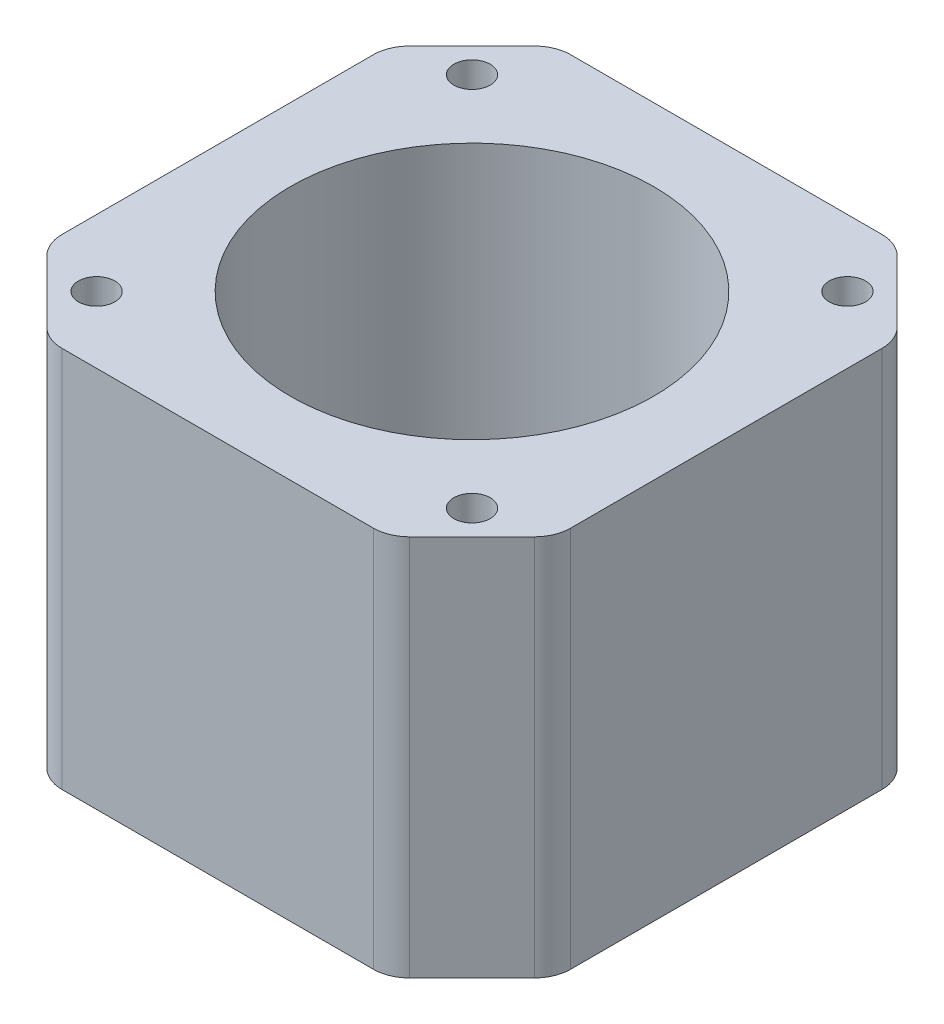
ISO-10303-21;
HEADER;
FILE_DESCRIPTION(('STEP AP214'),'2;1');
FILE_NAME('part.step','',(''),(''),'','','');
FILE_SCHEMA(('AUTOMOTIVE_DESIGN { 1 0 10303 214 1 1 1 1 }'));
ENDSEC;
DATA;
#1=APPLICATION_CONTEXT('core data for automotive mechanical design processes');
#2=APPLICATION_PROTOCOL_DEFINITION('international standard','automotive_design',2000,#1);
#3=PRODUCT_CONTEXT('',#1,'mechanical');
#4=PRODUCT('Part','Part','',(#3));
#5=PRODUCT_RELATED_PRODUCT_CATEGORY('part','',(#4));
#6=PRODUCT_DEFINITION_FORMATION('','',#4);
#7=PRODUCT_DEFINITION_CONTEXT('part definition',#1,'design');
#8=PRODUCT_DEFINITION('design','',#6,#7);
#9=PRODUCT_DEFINITION_SHAPE('','',#8);
#10=(LENGTH_UNIT() NAMED_UNIT(*) SI_UNIT(.MILLI.,.METRE.));
#11=(NAMED_UNIT(*) PLANE_ANGLE_UNIT() SI_UNIT($,.RADIAN.));
#12=(NAMED_UNIT(*) SI_UNIT($,.STERADIAN.) SOLID_ANGLE_UNIT());
#13=UNCERTAINTY_MEASURE_WITH_UNIT(LENGTH_MEASURE(1.E-05),#10,'distance_accuracy_value','');
#14=(GEOMETRIC_REPRESENTATION_CONTEXT(3) GLOBAL_UNCERTAINTY_ASSIGNED_CONTEXT((#13)) GLOBAL_UNIT_ASSIGNED_CONTEXT((#10,
#11,#12)) REPRESENTATION_CONTEXT('',''));
#15=CARTESIAN_POINT('',(0.,0.,0.));
#16=DIRECTION('',(0.,0.,1.));
#17=DIRECTION('',(1.,0.,0.));
#18=AXIS2_PLACEMENT_3D('',#15,#16,#17);
#19=CARTESIAN_POINT('',(-12.85735931288,0.,18.));
#20=DIRECTION('',(0.,1.,0.));
#21=DIRECTION('',(0.,0.,1.));
#22=AXIS2_PLACEMENT_3D('',#19,#20,#21);
#23=CYLINDRICAL_SURFACE('',#22,3.00000000000053);
#24=CARTESIAN_POINT('',(-12.85735931288,31.55,18.));
#25=DIRECTION('',(0.,1.,0.));
#26=DIRECTION('',(0.,0.,1.));
#27=AXIS2_PLACEMENT_3D('',#24,#25,#26);
#28=CIRCLE('',#27,3.00000000000053);
#29=CARTESIAN_POINT('',(-14.97867965644,31.55,20.12132034356));
#30=VERTEX_POINT('',#29);
#31=CARTESIAN_POINT('',(-12.8573593128803,31.55,21.0000000000006));
#32=VERTEX_POINT('',#31);
#33=EDGE_CURVE('E178',#30,#32,#28,.T.);
#34=ORIENTED_EDGE('',*,*,#33,.F.);
#35=DIRECTION('',(0.,1.,0.));
#36=VECTOR('',#35,1.);
#37=CARTESIAN_POINT('',(-14.97867965644,0.,20.12132034356));
#38=LINE('',#37,#36);
#39=CARTESIAN_POINT('',(-14.97867965644,0.,20.12132034356));
#40=VERTEX_POINT('',#39);
#41=EDGE_CURVE('E11',#40,#30,#38,.T.);
#42=ORIENTED_EDGE('',*,*,#41,.F.);
#43=CARTESIAN_POINT('',(-12.85735931288,0.,18.));
#44=DIRECTION('',(0.,1.,0.));
#45=DIRECTION('',(0.,0.,1.));
#46=AXIS2_PLACEMENT_3D('',#43,#44,#45);
#47=CIRCLE('',#46,3.00000000000053);
#48=CARTESIAN_POINT('',(-12.8573593128803,0.,21.0000000000006));
#49=VERTEX_POINT('',#48);
#50=EDGE_CURVE('E223',#40,#49,#47,.T.);
#51=ORIENTED_EDGE('',*,*,#50,.T.);
#52=DIRECTION('',(0.,1.,0.));
#53=VECTOR('',#52,1.);
#54=CARTESIAN_POINT('',(-12.8573593128803,0.,21.0000000000006));
#55=LINE('',#54,#53);
#56=EDGE_CURVE('E36',#49,#32,#55,.T.);
#57=ORIENTED_EDGE('',*,*,#56,.T.);
#58=EDGE_LOOP('',(#34,#42,#51,#57));
#59=FACE_BOUND('',#58,.T.);
#60=ADVANCED_FACE('F33',(#59),#23,.T.);
#61=CARTESIAN_POINT('',(-20.1213203435597,0.,14.9786796564406));
#62=DIRECTION('',(-0.707106781186531,0.,0.707106781186564));
#63=DIRECTION('',(0.707106781186564,0.,0.707106781186531));
#64=AXIS2_PLACEMENT_3D('',#61,#62,#63);
#65=PLANE('',#64);
#66=DIRECTION('',(0.707106781186564,0.,0.707106781186531));
#67=VECTOR('',#66,1.);
#68=CARTESIAN_POINT('',(-20.1213203435597,31.55,14.9786796564406));
#69=LINE('',#68,#67);
#70=CARTESIAN_POINT('',(-20.1213203435597,31.55,14.9786796564406));
#71=VERTEX_POINT('',#70);
#72=EDGE_CURVE('E221',#71,#30,#69,.T.);
#73=ORIENTED_EDGE('',*,*,#72,.F.);
#74=DIRECTION('',(0.,1.,0.));
#75=VECTOR('',#74,1.);
#76=CARTESIAN_POINT('',(-20.1213203435597,0.,14.9786796564406));
#77=LINE('',#76,#75);
#78=CARTESIAN_POINT('',(-20.1213203435597,0.,14.9786796564406));
#79=VERTEX_POINT('',#78);
#80=EDGE_CURVE('E42',#79,#71,#77,.T.);
#81=ORIENTED_EDGE('',*,*,#80,.F.);
#82=DIRECTION('',(0.707106781186564,0.,0.707106781186531));
#83=VECTOR('',#82,1.);
#84=CARTESIAN_POINT('',(-20.1213203435597,0.,14.9786796564406));
#85=LINE('',#84,#83);
#86=EDGE_CURVE('E168',#79,#40,#85,.T.);
#87=ORIENTED_EDGE('',*,*,#86,.T.);
#88=ORIENTED_EDGE('',*,*,#41,.T.);
#89=EDGE_LOOP('',(#73,#81,#87,#88));
#90=FACE_BOUND('',#89,.T.);
#91=ADVANCED_FACE('F251',(#90),#65,.T.);
#92=CARTESIAN_POINT('',(-18.,0.,12.857359312881));
#93=DIRECTION('',(0.,1.,0.));
#94=DIRECTION('',(0.,0.,1.));
#95=AXIS2_PLACEMENT_3D('',#92,#93,#94);
#96=CYLINDRICAL_SURFACE('',#95,2.99999999999999);
#97=CARTESIAN_POINT('',(-18.,31.55,12.857359312881));
#98=DIRECTION('',(0.,1.,0.));
#99=DIRECTION('',(0.,0.,1.));
#100=AXIS2_PLACEMENT_3D('',#97,#98,#99);
#101=CIRCLE('',#100,2.99999999999999);
#102=CARTESIAN_POINT('',(-21.,31.55,12.857359312881));
#103=VERTEX_POINT('',#102);
#104=EDGE_CURVE('E155',#103,#71,#101,.T.);
#105=ORIENTED_EDGE('',*,*,#104,.F.);
#106=DIRECTION('',(0.,1.,0.));
#107=VECTOR('',#106,1.);
#108=CARTESIAN_POINT('',(-21.,0.,12.857359312881));
#109=LINE('',#108,#107);
#110=CARTESIAN_POINT('',(-21.,0.,12.857359312881));
#111=VERTEX_POINT('',#110);
#112=EDGE_CURVE('E150',#111,#103,#109,.T.);
#113=ORIENTED_EDGE('',*,*,#112,.F.);
#114=CARTESIAN_POINT('',(-18.,0.,12.857359312881));
#115=DIRECTION('',(0.,1.,0.));
#116=DIRECTION('',(0.,0.,1.));
#117=AXIS2_PLACEMENT_3D('',#114,#115,#116);
#118=CIRCLE('',#117,2.99999999999999);
#119=EDGE_CURVE('E153',#111,#79,#118,.T.);
#120=ORIENTED_EDGE('',*,*,#119,.T.);
#121=ORIENTED_EDGE('',*,*,#80,.T.);
#122=EDGE_LOOP('',(#105,#113,#120,#121));
#123=FACE_BOUND('',#122,.T.);
#124=ADVANCED_FACE('F152',(#123),#96,.T.);
#125=CARTESIAN_POINT('',(-21.,0.,-12.85735931288));
#126=DIRECTION('',(-1.,0.,0.));
#127=DIRECTION('',(0.,0.,1.));
#128=AXIS2_PLACEMENT_3D('',#125,#126,#127);
#129=PLANE('',#128);
#130=DIRECTION('',(0.,0.,1.));
#131=VECTOR('',#130,1.);
#132=CARTESIAN_POINT('',(-21.,31.55,-12.85735931288));
#133=LINE('',#132,#131);
#134=CARTESIAN_POINT('',(-21.,31.55,-12.85735931288));
#135=VERTEX_POINT('',#134);
#136=EDGE_CURVE('E218',#135,#103,#133,.T.);
#137=ORIENTED_EDGE('',*,*,#136,.F.);
#138=DIRECTION('',(0.,1.,0.));
#139=VECTOR('',#138,1.);
#140=CARTESIAN_POINT('',(-21.,0.,-12.85735931288));
#141=LINE('',#140,#139);
#142=CARTESIAN_POINT('',(-21.,0.,-12.85735931288));
#143=VERTEX_POINT('',#142);
#144=EDGE_CURVE('E160',#143,#135,#141,.T.);
#145=ORIENTED_EDGE('',*,*,#144,.F.);
#146=DIRECTION('',(0.,0.,1.));
#147=VECTOR('',#146,1.);
#148=CARTESIAN_POINT('',(-21.,0.,-12.85735931288));
#149=LINE('',#148,#147);
#150=EDGE_CURVE('E166',#143,#111,#149,.T.);
#151=ORIENTED_EDGE('',*,*,#150,.T.);
#152=ORIENTED_EDGE('',*,*,#112,.T.);
#153=EDGE_LOOP('',(#137,#145,#151,#152));
#154=FACE_BOUND('',#153,.T.);
#155=ADVANCED_FACE('F170',(#154),#129,.T.);
#156=CARTESIAN_POINT('',(-18.,0.,-12.85735931288));
#157=DIRECTION('',(0.,1.,0.));
#158=DIRECTION('',(0.,0.,1.));
#159=AXIS2_PLACEMENT_3D('',#156,#157,#158);
#160=CYLINDRICAL_SURFACE('',#159,3.00000000000004);
#161=CARTESIAN_POINT('',(-18.,31.55,-12.85735931288));
#162=DIRECTION('',(0.,1.,0.));
#163=DIRECTION('',(0.,0.,1.));
#164=AXIS2_PLACEMENT_3D('',#161,#162,#163);
#165=CIRCLE('',#164,3.00000000000004);
#166=CARTESIAN_POINT('',(-20.1213203435596,31.55,-14.9786796564398));
#167=VERTEX_POINT('',#166);
#168=EDGE_CURVE('E215',#167,#135,#165,.T.);
#169=ORIENTED_EDGE('',*,*,#168,.F.);
#170=DIRECTION('',(0.,1.,0.));
#171=VECTOR('',#170,1.);
#172=CARTESIAN_POINT('',(-20.1213203435596,0.,-14.9786796564398));
#173=LINE('',#172,#171);
#174=CARTESIAN_POINT('',(-20.1213203435596,0.,-14.9786796564398));
#175=VERTEX_POINT('',#174);
#176=EDGE_CURVE('E227',#175,#167,#173,.T.);
#177=ORIENTED_EDGE('',*,*,#176,.F.);
#178=CARTESIAN_POINT('',(-18.,0.,-12.85735931288));
#179=DIRECTION('',(0.,1.,0.));
#180=DIRECTION('',(0.,0.,1.));
#181=AXIS2_PLACEMENT_3D('',#178,#179,#180);
#182=CIRCLE('',#181,3.00000000000004);
#183=EDGE_CURVE('E171',#175,#143,#182,.T.);
#184=ORIENTED_EDGE('',*,*,#183,.T.);
#185=ORIENTED_EDGE('',*,*,#144,.T.);
#186=EDGE_LOOP('',(#169,#177,#184,#185));
#187=FACE_BOUND('',#186,.T.);
#188=ADVANCED_FACE('F264',(#187),#160,.T.);
#189=CARTESIAN_POINT('',(-14.97867965644,0.,-20.12132034356));
#190=DIRECTION('',(-0.70710678118659,0.,-0.707106781186506));
#191=DIRECTION('',(-0.707106781186506,0.,0.70710678118659));
#192=AXIS2_PLACEMENT_3D('',#189,#190,#191);
#193=PLANE('',#192);
#194=DIRECTION('',(-0.707106781186506,0.,0.70710678118659));
#195=VECTOR('',#194,1.);
#196=CARTESIAN_POINT('',(-14.97867965644,31.55,-20.12132034356));
#197=LINE('',#196,#195);
#198=CARTESIAN_POINT('',(-14.9786796564398,31.55,-20.1213203435598));
#199=VERTEX_POINT('',#198);
#200=EDGE_CURVE('E212',#199,#167,#197,.T.);
#201=ORIENTED_EDGE('',*,*,#200,.F.);
#202=DIRECTION('',(0.,1.,0.));
#203=VECTOR('',#202,1.);
#204=CARTESIAN_POINT('',(-14.9786796564398,0.,-20.1213203435598));
#205=LINE('',#204,#203);
#206=CARTESIAN_POINT('',(-14.9786796564398,0.,-20.1213203435598));
#207=VERTEX_POINT('',#206);
#208=EDGE_CURVE('E229',#207,#199,#205,.T.);
#209=ORIENTED_EDGE('',*,*,#208,.F.);
#210=DIRECTION('',(-0.707106781186506,0.,0.70710678118659));
#211=VECTOR('',#210,1.);
#212=CARTESIAN_POINT('',(-14.97867965644,0.,-20.12132034356));
#213=LINE('',#212,#211);
#214=EDGE_CURVE('E173',#207,#175,#213,.T.);
#215=ORIENTED_EDGE('',*,*,#214,.T.);
#216=ORIENTED_EDGE('',*,*,#176,.T.);
#217=EDGE_LOOP('',(#201,#209,#215,#216));
#218=FACE_BOUND('',#217,.T.);
#219=ADVANCED_FACE('F267',(#218),#193,.T.);
#220=CARTESIAN_POINT('',(-12.85735931288,0.,-18.));
#221=DIRECTION('',(0.,1.,0.));
#222=DIRECTION('',(0.,0.,1.));
#223=AXIS2_PLACEMENT_3D('',#220,#221,#222);
#224=CYLINDRICAL_SURFACE('',#223,3.00000000000025);
#225=CARTESIAN_POINT('',(-12.85735931288,31.55,-18.));
#226=DIRECTION('',(0.,1.,0.));
#227=DIRECTION('',(0.,0.,1.));
#228=AXIS2_PLACEMENT_3D('',#225,#226,#227);
#229=CIRCLE('',#228,3.00000000000025);
#230=CARTESIAN_POINT('',(-12.85735931288,31.55,-21.));
#231=VERTEX_POINT('',#230);
#232=EDGE_CURVE('E209',#231,#199,#229,.T.);
#233=ORIENTED_EDGE('',*,*,#232,.F.);
#234=DIRECTION('',(0.,1.,0.));
#235=VECTOR('',#234,1.);
#236=CARTESIAN_POINT('',(-12.85735931288,0.,-21.));
#237=LINE('',#236,#235);
#238=CARTESIAN_POINT('',(-12.85735931288,0.,-21.));
#239=VERTEX_POINT('',#238);
#240=EDGE_CURVE('E231',#239,#231,#237,.T.);
#241=ORIENTED_EDGE('',*,*,#240,.F.);
#242=CARTESIAN_POINT('',(-12.85735931288,0.,-18.));
#243=DIRECTION('',(0.,1.,0.));
#244=DIRECTION('',(0.,0.,1.));
#245=AXIS2_PLACEMENT_3D('',#242,#243,#244);
#246=CIRCLE('',#245,3.00000000000025);
#247=EDGE_CURVE('E399',#239,#207,#246,.T.);
#248=ORIENTED_EDGE('',*,*,#247,.T.);
#249=ORIENTED_EDGE('',*,*,#208,.T.);
#250=EDGE_LOOP('',(#233,#241,#248,#249));
#251=FACE_BOUND('',#250,.T.);
#252=ADVANCED_FACE('F271',(#251),#224,.T.);
#253=CARTESIAN_POINT('',(12.857359312881,0.,-21.));
#254=DIRECTION('',(0.,0.,-1.));
#255=DIRECTION('',(-1.,0.,0.));
#256=AXIS2_PLACEMENT_3D('',#253,#254,#255);
#257=PLANE('',#256);
#258=DIRECTION('',(-1.,0.,0.));
#259=VECTOR('',#258,1.);
#260=CARTESIAN_POINT('',(12.857359312881,31.55,-21.));
#261=LINE('',#260,#259);
#262=CARTESIAN_POINT('',(12.857359312881,31.55,-21.));
#263=VERTEX_POINT('',#262);
#264=EDGE_CURVE('E206',#263,#231,#261,.T.);
#265=ORIENTED_EDGE('',*,*,#264,.F.);
#266=DIRECTION('',(0.,1.,0.));
#267=VECTOR('',#266,1.);
#268=CARTESIAN_POINT('',(12.857359312881,0.,-21.));
#269=LINE('',#268,#267);
#270=CARTESIAN_POINT('',(12.857359312881,0.,-21.));
#271=VERTEX_POINT('',#270);
#272=EDGE_CURVE('E233',#271,#263,#269,.T.);
#273=ORIENTED_EDGE('',*,*,#272,.F.);
#274=DIRECTION('',(-1.,0.,0.));
#275=VECTOR('',#274,1.);
#276=CARTESIAN_POINT('',(12.857359312881,0.,-21.));
#277=LINE('',#276,#275);
#278=EDGE_CURVE('E396',#271,#239,#277,.T.);
#279=ORIENTED_EDGE('',*,*,#278,.T.);
#280=ORIENTED_EDGE('',*,*,#240,.T.);
#281=EDGE_LOOP('',(#265,#273,#279,#280));
#282=FACE_BOUND('',#281,.T.);
#283=ADVANCED_FACE('F275',(#282),#257,.T.);
#284=CARTESIAN_POINT('',(12.857359312881,0.,-18.));
#285=DIRECTION('',(0.,1.,0.));
#286=DIRECTION('',(0.,0.,1.));
#287=AXIS2_PLACEMENT_3D('',#284,#285,#286);
#288=CYLINDRICAL_SURFACE('',#287,3.00000000000003);
#289=CARTESIAN_POINT('',(12.857359312881,31.55,-18.));
#290=DIRECTION('',(0.,1.,0.));
#291=DIRECTION('',(0.,0.,1.));
#292=AXIS2_PLACEMENT_3D('',#289,#290,#291);
#293=CIRCLE('',#292,3.00000000000003);
#294=CARTESIAN_POINT('',(14.9786796564406,31.55,-20.1213203435598));
#295=VERTEX_POINT('',#294);
#296=EDGE_CURVE('E203',#295,#263,#293,.T.);
#297=ORIENTED_EDGE('',*,*,#296,.F.);
#298=DIRECTION('',(0.,1.,0.));
#299=VECTOR('',#298,1.);
#300=CARTESIAN_POINT('',(14.9786796564406,0.,-20.1213203435598));
#301=LINE('',#300,#299);
#302=CARTESIAN_POINT('',(14.9786796564406,0.,-20.1213203435598));
#303=VERTEX_POINT('',#302);
#304=EDGE_CURVE('E235',#303,#295,#301,.T.);
#305=ORIENTED_EDGE('',*,*,#304,.F.);
#306=CARTESIAN_POINT('',(12.857359312881,0.,-18.));
#307=DIRECTION('',(0.,1.,0.));
#308=DIRECTION('',(0.,0.,1.));
#309=AXIS2_PLACEMENT_3D('',#306,#307,#308);
#310=CIRCLE('',#309,3.00000000000003);
#311=EDGE_CURVE('E393',#303,#271,#310,.T.);
#312=ORIENTED_EDGE('',*,*,#311,.T.);
#313=ORIENTED_EDGE('',*,*,#272,.T.);
#314=EDGE_LOOP('',(#297,#305,#312,#313));
#315=FACE_BOUND('',#314,.T.);
#316=ADVANCED_FACE('F279',(#315),#288,.T.);
#317=CARTESIAN_POINT('',(20.1213203435595,0.,-14.9786796564409));
#318=DIRECTION('',(0.707106781186548,0.,-0.707106781186547));
#319=DIRECTION('',(-0.707106781186547,0.,-0.707106781186548));
#320=AXIS2_PLACEMENT_3D('',#317,#318,#319);
#321=PLANE('',#320);
#322=DIRECTION('',(-0.707106781186547,0.,-0.707106781186548));
#323=VECTOR('',#322,1.);
#324=CARTESIAN_POINT('',(20.1213203435595,31.55,-14.9786796564409));
#325=LINE('',#324,#323);
#326=CARTESIAN_POINT('',(20.1213203435595,31.55,-14.9786796564409));
#327=VERTEX_POINT('',#326);
#328=EDGE_CURVE('E200',#327,#295,#325,.T.);
#329=ORIENTED_EDGE('',*,*,#328,.F.);
#330=DIRECTION('',(0.,1.,0.));
#331=VECTOR('',#330,1.);
#332=CARTESIAN_POINT('',(20.1213203435595,0.,-14.9786796564409));
#333=LINE('',#332,#331);
#334=CARTESIAN_POINT('',(20.1213203435595,0.,-14.9786796564409));
#335=VERTEX_POINT('',#334);
#336=EDGE_CURVE('E237',#335,#327,#333,.T.);
#337=ORIENTED_EDGE('',*,*,#336,.F.);
#338=DIRECTION('',(-0.707106781186547,0.,-0.707106781186548));
#339=VECTOR('',#338,1.);
#340=CARTESIAN_POINT('',(20.1213203435595,0.,-14.9786796564409));
#341=LINE('',#340,#339);
#342=EDGE_CURVE('E390',#335,#303,#341,.T.);
#343=ORIENTED_EDGE('',*,*,#342,.T.);
#344=ORIENTED_EDGE('',*,*,#304,.T.);
#345=EDGE_LOOP('',(#329,#337,#343,#344));
#346=FACE_BOUND('',#345,.T.);
#347=ADVANCED_FACE('F283',(#346),#321,.T.);
#348=CARTESIAN_POINT('',(17.9999999999996,0.,-12.8573593128811));
#349=DIRECTION('',(0.,1.,0.));
#350=DIRECTION('',(0.,0.,1.));
#351=AXIS2_PLACEMENT_3D('',#348,#349,#350);
#352=CYLINDRICAL_SURFACE('',#351,3.00000000000025);
#353=CARTESIAN_POINT('',(17.9999999999996,31.55,-12.8573593128811));
#354=DIRECTION('',(0.,1.,0.));
#355=DIRECTION('',(0.,0.,1.));
#356=AXIS2_PLACEMENT_3D('',#353,#354,#355);
#357=CIRCLE('',#356,3.00000000000025);
#358=CARTESIAN_POINT('',(20.9999999999999,31.55,-12.8573593128811));
#359=VERTEX_POINT('',#358);
#360=EDGE_CURVE('E197',#359,#327,#357,.T.);
#361=ORIENTED_EDGE('',*,*,#360,.F.);
#362=DIRECTION('',(0.,1.,0.));
#363=VECTOR('',#362,1.);
#364=CARTESIAN_POINT('',(20.9999999999999,0.,-12.8573593128811));
#365=LINE('',#364,#363);
#366=CARTESIAN_POINT('',(20.9999999999999,0.,-12.8573593128811));
#367=VERTEX_POINT('',#366);
#368=EDGE_CURVE('E239',#367,#359,#365,.T.);
#369=ORIENTED_EDGE('',*,*,#368,.F.);
#370=CARTESIAN_POINT('',(17.9999999999996,0.,-12.8573593128811));
#371=DIRECTION('',(0.,1.,0.));
#372=DIRECTION('',(0.,0.,1.));
#373=AXIS2_PLACEMENT_3D('',#370,#371,#372);
#374=CIRCLE('',#373,3.00000000000025);
#375=EDGE_CURVE('E387',#367,#335,#374,.T.);
#376=ORIENTED_EDGE('',*,*,#375,.T.);
#377=ORIENTED_EDGE('',*,*,#336,.T.);
#378=EDGE_LOOP('',(#361,#369,#376,#377));
#379=FACE_BOUND('',#378,.T.);
#380=ADVANCED_FACE('F287',(#379),#352,.T.);
#381=CARTESIAN_POINT('',(20.9999999999999,0.,12.8573593128817));
#382=DIRECTION('',(1.,0.,0.));
#383=DIRECTION('',(0.,0.,-1.));
#384=AXIS2_PLACEMENT_3D('',#381,#382,#383);
#385=PLANE('',#384);
#386=DIRECTION('',(0.,0.,-1.));
#387=VECTOR('',#386,1.);
#388=CARTESIAN_POINT('',(20.9999999999999,31.55,12.8573593128817));
#389=LINE('',#388,#387);
#390=CARTESIAN_POINT('',(20.9999999999999,31.55,12.8573593128817));
#391=VERTEX_POINT('',#390);
#392=EDGE_CURVE('E194',#391,#359,#389,.T.);
#393=ORIENTED_EDGE('',*,*,#392,.F.);
#394=DIRECTION('',(0.,1.,0.));
#395=VECTOR('',#394,1.);
#396=CARTESIAN_POINT('',(20.9999999999999,0.,12.8573593128817));
#397=LINE('',#396,#395);
#398=CARTESIAN_POINT('',(20.9999999999999,0.,12.8573593128817));
#399=VERTEX_POINT('',#398);
#400=EDGE_CURVE('E241',#399,#391,#397,.T.);
#401=ORIENTED_EDGE('',*,*,#400,.F.);
#402=DIRECTION('',(0.,0.,-1.));
#403=VECTOR('',#402,1.);
#404=CARTESIAN_POINT('',(20.9999999999999,0.,12.8573593128817));
#405=LINE('',#404,#403);
#406=EDGE_CURVE('E384',#399,#367,#405,.T.);
#407=ORIENTED_EDGE('',*,*,#406,.T.);
#408=ORIENTED_EDGE('',*,*,#368,.T.);
#409=EDGE_LOOP('',(#393,#401,#407,#408));
#410=FACE_BOUND('',#409,.T.);
#411=ADVANCED_FACE('F291',(#410),#385,.T.);
#412=CARTESIAN_POINT('',(18.,0.,12.8573593128817));
#413=DIRECTION('',(0.,1.,0.));
#414=DIRECTION('',(0.,0.,1.));
#415=AXIS2_PLACEMENT_3D('',#412,#413,#414);
#416=CYLINDRICAL_SURFACE('',#415,2.9999999999999);
#417=CARTESIAN_POINT('',(18.,31.55,12.8573593128817));
#418=DIRECTION('',(0.,1.,0.));
#419=DIRECTION('',(0.,0.,1.));
#420=AXIS2_PLACEMENT_3D('',#417,#418,#419);
#421=CIRCLE('',#420,2.9999999999999);
#422=CARTESIAN_POINT('',(20.1213203435596,31.55,14.9786796564412));
#423=VERTEX_POINT('',#422);
#424=EDGE_CURVE('E191',#423,#391,#421,.T.);
#425=ORIENTED_EDGE('',*,*,#424,.F.);
#426=DIRECTION('',(0.,1.,0.));
#427=VECTOR('',#426,1.);
#428=CARTESIAN_POINT('',(20.1213203435596,0.,14.9786796564412));
#429=LINE('',#428,#427);
#430=CARTESIAN_POINT('',(20.1213203435596,0.,14.9786796564412));
#431=VERTEX_POINT('',#430);
#432=EDGE_CURVE('E243',#431,#423,#429,.T.);
#433=ORIENTED_EDGE('',*,*,#432,.F.);
#434=CARTESIAN_POINT('',(18.,0.,12.8573593128817));
#435=DIRECTION('',(0.,1.,0.));
#436=DIRECTION('',(0.,0.,1.));
#437=AXIS2_PLACEMENT_3D('',#434,#435,#436);
#438=CIRCLE('',#437,2.9999999999999);
#439=EDGE_CURVE('E381',#431,#399,#438,.T.);
#440=ORIENTED_EDGE('',*,*,#439,.T.);
#441=ORIENTED_EDGE('',*,*,#400,.T.);
#442=EDGE_LOOP('',(#425,#433,#440,#441));
#443=FACE_BOUND('',#442,.T.);
#444=ADVANCED_FACE('F295',(#443),#416,.T.);
#445=CARTESIAN_POINT('',(14.9786796564406,0.,20.1213203435602));
#446=DIRECTION('',(0.707106781186548,0.,0.707106781186547));
#447=DIRECTION('',(0.707106781186547,0.,-0.707106781186548));
#448=AXIS2_PLACEMENT_3D('',#445,#446,#447);
#449=PLANE('',#448);
#450=DIRECTION('',(0.707106781186547,0.,-0.707106781186548));
#451=VECTOR('',#450,1.);
#452=CARTESIAN_POINT('',(14.9786796564406,31.55,20.1213203435602));
#453=LINE('',#452,#451);
#454=CARTESIAN_POINT('',(14.9786796564406,31.55,20.1213203435602));
#455=VERTEX_POINT('',#454);
#456=EDGE_CURVE('E188',#455,#423,#453,.T.);
#457=ORIENTED_EDGE('',*,*,#456,.F.);
#458=DIRECTION('',(0.,1.,0.));
#459=VECTOR('',#458,1.);
#460=CARTESIAN_POINT('',(14.9786796564406,0.,20.1213203435602));
#461=LINE('',#460,#459);
#462=CARTESIAN_POINT('',(14.9786796564406,0.,20.1213203435602));
#463=VERTEX_POINT('',#462);
#464=EDGE_CURVE('E245',#463,#455,#461,.T.);
#465=ORIENTED_EDGE('',*,*,#464,.F.);
#466=DIRECTION('',(0.707106781186547,0.,-0.707106781186548));
#467=VECTOR('',#466,1.);
#468=CARTESIAN_POINT('',(14.9786796564406,0.,20.1213203435602));
#469=LINE('',#468,#467);
#470=EDGE_CURVE('E378',#463,#431,#469,.T.);
#471=ORIENTED_EDGE('',*,*,#470,.T.);
#472=ORIENTED_EDGE('',*,*,#432,.T.);
#473=EDGE_LOOP('',(#457,#465,#471,#472));
#474=FACE_BOUND('',#473,.T.);
#475=ADVANCED_FACE('F299',(#474),#449,.T.);
#476=CARTESIAN_POINT('',(12.857359312881,0.,18.0000000000007));
#477=DIRECTION('',(0.,1.,0.));
#478=DIRECTION('',(0.,0.,1.));
#479=AXIS2_PLACEMENT_3D('',#476,#477,#478);
#480=CYLINDRICAL_SURFACE('',#479,2.9999999999999);
#481=CARTESIAN_POINT('',(12.857359312881,31.55,18.0000000000007));
#482=DIRECTION('',(0.,1.,0.));
#483=DIRECTION('',(0.,0.,1.));
#484=AXIS2_PLACEMENT_3D('',#481,#482,#483);
#485=CIRCLE('',#484,2.9999999999999);
#486=CARTESIAN_POINT('',(12.857359312881,31.55,21.0000000000005));
#487=VERTEX_POINT('',#486);
#488=EDGE_CURVE('E185',#487,#455,#485,.T.);
#489=ORIENTED_EDGE('',*,*,#488,.F.);
#490=DIRECTION('',(0.,1.,0.));
#491=VECTOR('',#490,1.);
#492=CARTESIAN_POINT('',(12.857359312881,0.,21.0000000000005));
#493=LINE('',#492,#491);
#494=CARTESIAN_POINT('',(12.857359312881,0.,21.0000000000005));
#495=VERTEX_POINT('',#494);
#496=EDGE_CURVE('E246',#495,#487,#493,.T.);
#497=ORIENTED_EDGE('',*,*,#496,.F.);
#498=CARTESIAN_POINT('',(12.857359312881,0.,18.0000000000007));
#499=DIRECTION('',(0.,1.,0.));
#500=DIRECTION('',(0.,0.,1.));
#501=AXIS2_PLACEMENT_3D('',#498,#499,#500);
#502=CIRCLE('',#501,2.9999999999999);
#503=EDGE_CURVE('E375',#495,#463,#502,.T.);
#504=ORIENTED_EDGE('',*,*,#503,.T.);
#505=ORIENTED_EDGE('',*,*,#464,.T.);
#506=EDGE_LOOP('',(#489,#497,#504,#505));
#507=FACE_BOUND('',#506,.T.);
#508=ADVANCED_FACE('F303',(#507),#480,.T.);
#509=CARTESIAN_POINT('',(-12.8573593128803,0.,21.0000000000006));
#510=DIRECTION('',(0.,0.,1.));
#511=DIRECTION('',(1.,0.,0.));
#512=AXIS2_PLACEMENT_3D('',#509,#510,#511);
#513=PLANE('',#512);
#514=DIRECTION('',(1.,0.,0.));
#515=VECTOR('',#514,1.);
#516=CARTESIAN_POINT('',(-12.8573593128803,31.55,21.0000000000006));
#517=LINE('',#516,#515);
#518=EDGE_CURVE('E181',#32,#487,#517,.T.);
#519=ORIENTED_EDGE('',*,*,#518,.F.);
#520=ORIENTED_EDGE('',*,*,#56,.F.);
#521=DIRECTION('',(1.,0.,0.));
#522=VECTOR('',#521,1.);
#523=CARTESIAN_POINT('',(-12.8573593128803,0.,21.0000000000006));
#524=LINE('',#523,#522);
#525=EDGE_CURVE('E373',#49,#495,#524,.T.);
#526=ORIENTED_EDGE('',*,*,#525,.T.);
#527=ORIENTED_EDGE('',*,*,#496,.T.);
#528=EDGE_LOOP('',(#519,#520,#526,#527));
#529=FACE_BOUND('',#528,.T.);
#530=ADVANCED_FACE('F248',(#529),#513,.T.);
#531=CARTESIAN_POINT('',(-12.85735931288,0.,18.));
#532=DIRECTION('',(0.,1.,0.));
#533=DIRECTION('',(0.,0.,1.));
#534=AXIS2_PLACEMENT_3D('',#531,#532,#533);
#535=PLANE('',#534);
#536=CARTESIAN_POINT('',(-15.5,0.,-15.5));
#537=DIRECTION('',(0.,1.,0.));
#538=DIRECTION('',(0.,0.,-1.));
#539=AXIS2_PLACEMENT_3D('',#536,#537,#538);
#540=CIRCLE('',#539,1.5);
#541=CARTESIAN_POINT('',(-15.5,0.,-17.));
#542=VERTEX_POINT('',#541);
#543=EDGE_CURVE('E342',#542,#542,#540,.T.);
#544=ORIENTED_EDGE('',*,*,#543,.T.);
#545=EDGE_LOOP('',(#544));
#546=FACE_BOUND('',#545,.T.);
#547=CARTESIAN_POINT('',(-15.5,0.,15.5));
#548=DIRECTION('',(0.,1.,0.));
#549=DIRECTION('',(0.,0.,-1.));
#550=AXIS2_PLACEMENT_3D('',#547,#548,#549);
#551=CIRCLE('',#550,1.5);
#552=CARTESIAN_POINT('',(-15.5,0.,14.));
#553=VERTEX_POINT('',#552);
#554=EDGE_CURVE('E350',#553,#553,#551,.T.);
#555=ORIENTED_EDGE('',*,*,#554,.T.);
#556=EDGE_LOOP('',(#555));
#557=FACE_BOUND('',#556,.T.);
#558=CARTESIAN_POINT('',(15.5,0.,-15.5));
#559=DIRECTION('',(0.,1.,0.));
#560=DIRECTION('',(0.,0.,-1.));
#561=AXIS2_PLACEMENT_3D('',#558,#559,#560);
#562=CIRCLE('',#561,1.5);
#563=CARTESIAN_POINT('',(15.5,0.,-17.));
#564=VERTEX_POINT('',#563);
#565=EDGE_CURVE('E356',#564,#564,#562,.T.);
#566=ORIENTED_EDGE('',*,*,#565,.T.);
#567=EDGE_LOOP('',(#566));
#568=FACE_BOUND('',#567,.T.);
#569=CARTESIAN_POINT('',(0.,0.,0.));
#570=DIRECTION('',(0.,1.,0.));
#571=DIRECTION('',(0.,0.,-1.));
#572=AXIS2_PLACEMENT_3D('',#569,#570,#571);
#573=CIRCLE('',#572,15.);
#574=CARTESIAN_POINT('',(0.,0.,-15.));
#575=VERTEX_POINT('',#574);
#576=EDGE_CURVE('E362',#575,#575,#573,.T.);
#577=ORIENTED_EDGE('',*,*,#576,.T.);
#578=EDGE_LOOP('',(#577));
#579=FACE_BOUND('',#578,.T.);
#580=CARTESIAN_POINT('',(15.5,0.,15.5));
#581=DIRECTION('',(0.,1.,0.));
#582=DIRECTION('',(0.,0.,-1.));
#583=AXIS2_PLACEMENT_3D('',#580,#581,#582);
#584=CIRCLE('',#583,1.5);
#585=CARTESIAN_POINT('',(15.5,0.,14.));
#586=VERTEX_POINT('',#585);
#587=EDGE_CURVE('E182',#586,#586,#584,.T.);
#588=ORIENTED_EDGE('',*,*,#587,.T.);
#589=EDGE_LOOP('',(#588));
#590=FACE_BOUND('',#589,.T.);
#591=ORIENTED_EDGE('',*,*,#50,.F.);
#592=ORIENTED_EDGE('',*,*,#86,.F.);
#593=ORIENTED_EDGE('',*,*,#119,.F.);
#594=ORIENTED_EDGE('',*,*,#150,.F.);
#595=ORIENTED_EDGE('',*,*,#183,.F.);
#596=ORIENTED_EDGE('',*,*,#214,.F.);
#597=ORIENTED_EDGE('',*,*,#247,.F.);
#598=ORIENTED_EDGE('',*,*,#278,.F.);
#599=ORIENTED_EDGE('',*,*,#311,.F.);
#600=ORIENTED_EDGE('',*,*,#342,.F.);
#601=ORIENTED_EDGE('',*,*,#375,.F.);
#602=ORIENTED_EDGE('',*,*,#406,.F.);
#603=ORIENTED_EDGE('',*,*,#439,.F.);
#604=ORIENTED_EDGE('',*,*,#470,.F.);
#605=ORIENTED_EDGE('',*,*,#503,.F.);
#606=ORIENTED_EDGE('',*,*,#525,.F.);
#607=EDGE_LOOP('',(#591,#592,#593,#594,#595,#596,#597,#598,#599,#600,#601,#602,#603,#604,#605,#606));
#608=FACE_BOUND('',#607,.T.);
#609=ADVANCED_FACE('F164',(#546,#557,#568,#579,#590,#608),#535,.F.);
#610=CARTESIAN_POINT('',(-12.85735931288,31.55,18.));
#611=DIRECTION('',(0.,1.,0.));
#612=DIRECTION('',(0.,0.,1.));
#613=AXIS2_PLACEMENT_3D('',#610,#611,#612);
#614=PLANE('',#613);
#615=CARTESIAN_POINT('',(-15.5,31.55,-15.5));
#616=DIRECTION('',(0.,1.,0.));
#617=DIRECTION('',(0.,0.,-1.));
#618=AXIS2_PLACEMENT_3D('',#615,#616,#617);
#619=CIRCLE('',#618,1.5);
#620=CARTESIAN_POINT('',(-15.5,31.55,-17.));
#621=VERTEX_POINT('',#620);
#622=EDGE_CURVE('E345',#621,#621,#619,.T.);
#623=ORIENTED_EDGE('',*,*,#622,.F.);
#624=EDGE_LOOP('',(#623));
#625=FACE_BOUND('',#624,.T.);
#626=CARTESIAN_POINT('',(-15.5,31.55,15.5));
#627=DIRECTION('',(0.,1.,0.));
#628=DIRECTION('',(0.,0.,-1.));
#629=AXIS2_PLACEMENT_3D('',#626,#627,#628);
#630=CIRCLE('',#629,1.5);
#631=CARTESIAN_POINT('',(-15.5,31.55,14.));
#632=VERTEX_POINT('',#631);
#633=EDGE_CURVE('E347',#632,#632,#630,.T.);
#634=ORIENTED_EDGE('',*,*,#633,.F.);
#635=EDGE_LOOP('',(#634));
#636=FACE_BOUND('',#635,.T.);
#637=CARTESIAN_POINT('',(15.5,31.55,-15.5));
#638=DIRECTION('',(0.,1.,0.));
#639=DIRECTION('',(0.,0.,-1.));
#640=AXIS2_PLACEMENT_3D('',#637,#638,#639);
#641=CIRCLE('',#640,1.5);
#642=CARTESIAN_POINT('',(15.5,31.55,-17.));
#643=VERTEX_POINT('',#642);
#644=EDGE_CURVE('E353',#643,#643,#641,.T.);
#645=ORIENTED_EDGE('',*,*,#644,.F.);
#646=EDGE_LOOP('',(#645));
#647=FACE_BOUND('',#646,.T.);
#648=CARTESIAN_POINT('',(0.,31.55,0.));
#649=DIRECTION('',(0.,1.,0.));
#650=DIRECTION('',(0.,0.,-1.));
#651=AXIS2_PLACEMENT_3D('',#648,#649,#650);
#652=CIRCLE('',#651,15.);
#653=CARTESIAN_POINT('',(0.,31.55,-15.));
#654=VERTEX_POINT('',#653);
#655=EDGE_CURVE('E359',#654,#654,#652,.T.);
#656=ORIENTED_EDGE('',*,*,#655,.F.);
#657=EDGE_LOOP('',(#656));
#658=FACE_BOUND('',#657,.T.);
#659=CARTESIAN_POINT('',(15.5,31.55,15.5));
#660=DIRECTION('',(0.,1.,0.));
#661=DIRECTION('',(0.,0.,-1.));
#662=AXIS2_PLACEMENT_3D('',#659,#660,#661);
#663=CIRCLE('',#662,1.5);
#664=CARTESIAN_POINT('',(15.5,31.55,14.));
#665=VERTEX_POINT('',#664);
#666=EDGE_CURVE('E365',#665,#665,#663,.T.);
#667=ORIENTED_EDGE('',*,*,#666,.F.);
#668=EDGE_LOOP('',(#667));
#669=FACE_BOUND('',#668,.T.);
#670=ORIENTED_EDGE('',*,*,#33,.T.);
#671=ORIENTED_EDGE('',*,*,#518,.T.);
#672=ORIENTED_EDGE('',*,*,#488,.T.);
#673=ORIENTED_EDGE('',*,*,#456,.T.);
#674=ORIENTED_EDGE('',*,*,#424,.T.);
#675=ORIENTED_EDGE('',*,*,#392,.T.);
#676=ORIENTED_EDGE('',*,*,#360,.T.);
#677=ORIENTED_EDGE('',*,*,#328,.T.);
#678=ORIENTED_EDGE('',*,*,#296,.T.);
#679=ORIENTED_EDGE('',*,*,#264,.T.);
#680=ORIENTED_EDGE('',*,*,#232,.T.);
#681=ORIENTED_EDGE('',*,*,#200,.T.);
#682=ORIENTED_EDGE('',*,*,#168,.T.);
#683=ORIENTED_EDGE('',*,*,#136,.T.);
#684=ORIENTED_EDGE('',*,*,#104,.T.);
#685=ORIENTED_EDGE('',*,*,#72,.T.);
#686=EDGE_LOOP('',(#670,#671,#672,#673,#674,#675,#676,#677,#678,#679,#680,#681,#682,#683,#684,#685));
#687=FACE_BOUND('',#686,.T.);
#688=ADVANCED_FACE('F250',(#625,#636,#647,#658,#669,#687),#614,.T.);
#689=CARTESIAN_POINT('',(15.5,0.,15.5));
#690=DIRECTION('',(0.,1.,0.));
#691=DIRECTION('',(0.,0.,1.));
#692=AXIS2_PLACEMENT_3D('',#689,#690,#691);
#693=CYLINDRICAL_SURFACE('',#692,1.5);
#694=ORIENTED_EDGE('',*,*,#587,.F.);
#695=EDGE_LOOP('',(#694));
#696=FACE_BOUND('',#695,.T.);
#697=ORIENTED_EDGE('',*,*,#666,.T.);
#698=EDGE_LOOP('',(#697));
#699=FACE_BOUND('',#698,.T.);
#700=ADVANCED_FACE('F315',(#696,#699),#693,.F.);
#701=CARTESIAN_POINT('',(0.,0.,0.));
#702=DIRECTION('',(0.,1.,0.));
#703=DIRECTION('',(0.,0.,1.));
#704=AXIS2_PLACEMENT_3D('',#701,#702,#703);
#705=CYLINDRICAL_SURFACE('',#704,15.);
#706=ORIENTED_EDGE('',*,*,#576,.F.);
#707=EDGE_LOOP('',(#706));
#708=FACE_BOUND('',#707,.T.);
#709=ORIENTED_EDGE('',*,*,#655,.T.);
#710=EDGE_LOOP('',(#709));
#711=FACE_BOUND('',#710,.T.);
#712=ADVANCED_FACE('F322',(#708,#711),#705,.F.);
#713=CARTESIAN_POINT('',(15.5,0.,-15.5));
#714=DIRECTION('',(0.,1.,0.));
#715=DIRECTION('',(0.,0.,1.));
#716=AXIS2_PLACEMENT_3D('',#713,#714,#715);
#717=CYLINDRICAL_SURFACE('',#716,1.5);
#718=ORIENTED_EDGE('',*,*,#565,.F.);
#719=EDGE_LOOP('',(#718));
#720=FACE_BOUND('',#719,.T.);
#721=ORIENTED_EDGE('',*,*,#644,.T.);
#722=EDGE_LOOP('',(#721));
#723=FACE_BOUND('',#722,.T.);
#724=ADVANCED_FACE('F326',(#720,#723),#717,.F.);
#725=CARTESIAN_POINT('',(-15.5,0.,15.5));
#726=DIRECTION('',(0.,1.,0.));
#727=DIRECTION('',(0.,0.,1.));
#728=AXIS2_PLACEMENT_3D('',#725,#726,#727);
#729=CYLINDRICAL_SURFACE('',#728,1.5);
#730=ORIENTED_EDGE('',*,*,#554,.F.);
#731=EDGE_LOOP('',(#730));
#732=FACE_BOUND('',#731,.T.);
#733=ORIENTED_EDGE('',*,*,#633,.T.);
#734=EDGE_LOOP('',(#733));
#735=FACE_BOUND('',#734,.T.);
#736=ADVANCED_FACE('F330',(#732,#735),#729,.F.);
#737=CARTESIAN_POINT('',(-15.5,0.,-15.5));
#738=DIRECTION('',(0.,1.,0.));
#739=DIRECTION('',(0.,0.,1.));
#740=AXIS2_PLACEMENT_3D('',#737,#738,#739);
#741=CYLINDRICAL_SURFACE('',#740,1.5);
#742=ORIENTED_EDGE('',*,*,#543,.F.);
#743=EDGE_LOOP('',(#742));
#744=FACE_BOUND('',#743,.T.);
#745=ORIENTED_EDGE('',*,*,#622,.T.);
#746=EDGE_LOOP('',(#745));
#747=FACE_BOUND('',#746,.T.);
#748=ADVANCED_FACE('F334',(#744,#747),#741,.F.);
#749=CLOSED_SHELL('',(#60,#91,#124,#155,#188,#219,#252,#283,#316,#347,#380,#411,#444,#475,#508,
#530,#609,#688,#700,#712,#724,#736,#748));
#750=MANIFOLD_SOLID_BREP('B2',#749);
#751=ADVANCED_BREP_SHAPE_REPRESENTATION('',(#18,#750),#14);
#752=SHAPE_DEFINITION_REPRESENTATION(#9,#751);
ENDSEC;
END-ISO-10303-21;
